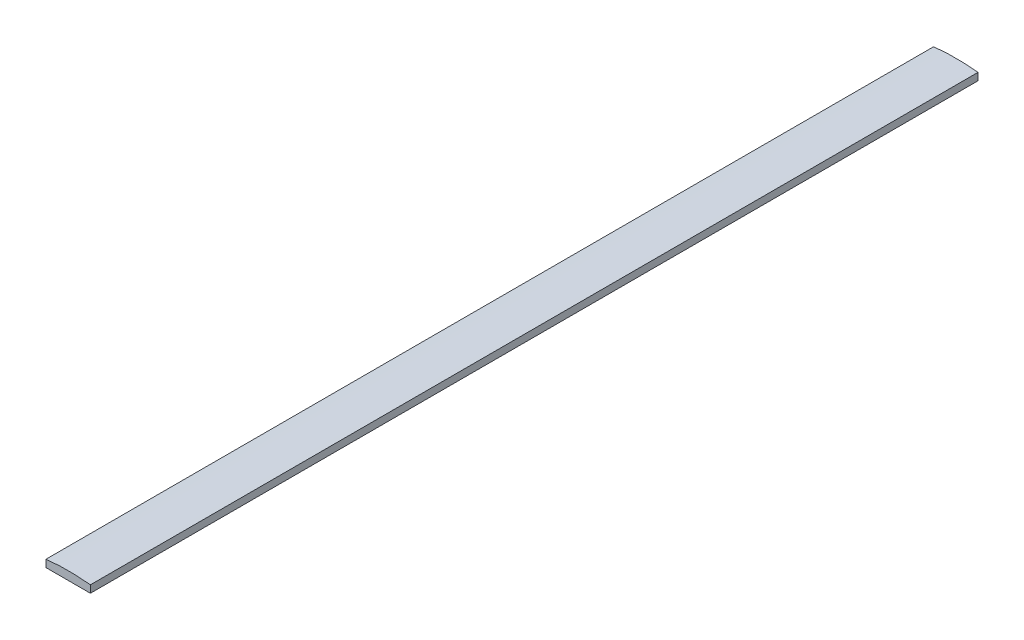
ISO-10303-21;
HEADER;
FILE_DESCRIPTION(('STEP AP214'),'2;1');
FILE_NAME('part.step','',(''),(''),'','','');
FILE_SCHEMA(('AUTOMOTIVE_DESIGN { 1 0 10303 214 1 1 1 1 }'));
ENDSEC;
DATA;
#1=APPLICATION_CONTEXT('core data for automotive mechanical design processes');
#2=APPLICATION_PROTOCOL_DEFINITION('international standard','automotive_design',2000,#1);
#3=PRODUCT_CONTEXT('',#1,'mechanical');
#4=PRODUCT('Part','Part','',(#3));
#5=PRODUCT_RELATED_PRODUCT_CATEGORY('part','',(#4));
#6=PRODUCT_DEFINITION_FORMATION('','',#4);
#7=PRODUCT_DEFINITION_CONTEXT('part definition',#1,'design');
#8=PRODUCT_DEFINITION('design','',#6,#7);
#9=PRODUCT_DEFINITION_SHAPE('','',#8);
#10=(LENGTH_UNIT() NAMED_UNIT(*) SI_UNIT(.MILLI.,.METRE.));
#11=(NAMED_UNIT(*) PLANE_ANGLE_UNIT() SI_UNIT($,.RADIAN.));
#12=(NAMED_UNIT(*) SI_UNIT($,.STERADIAN.) SOLID_ANGLE_UNIT());
#13=UNCERTAINTY_MEASURE_WITH_UNIT(LENGTH_MEASURE(1.E-05),#10,'distance_accuracy_value','');
#14=(GEOMETRIC_REPRESENTATION_CONTEXT(3) GLOBAL_UNCERTAINTY_ASSIGNED_CONTEXT((#13)) GLOBAL_UNIT_ASSIGNED_CONTEXT((#10,
#11,#12)) REPRESENTATION_CONTEXT('',''));
#15=CARTESIAN_POINT('',(0.,0.,0.));
#16=DIRECTION('',(0.,0.,1.));
#17=DIRECTION('',(1.,0.,0.));
#18=AXIS2_PLACEMENT_3D('',#15,#16,#17);
#19=CARTESIAN_POINT('',(-4.40361746141907,-70.4674372057608,330.));
#20=DIRECTION('',(0.,0.,-1.));
#21=DIRECTION('',(-1.,0.,0.));
#22=AXIS2_PLACEMENT_3D('',#19,#20,#21);
#23=CYLINDRICAL_SURFACE('',#22,76.);
#24=CARTESIAN_POINT('',(-4.40361746141907,-70.4674372057608,0.));
#25=DIRECTION('',(0.,0.,1.));
#26=DIRECTION('',(1.,0.,0.));
#27=AXIS2_PLACEMENT_3D('',#24,#25,#26);
#28=CIRCLE('',#27,76.);
#29=CARTESIAN_POINT('',(3.84638253858093,5.08345623700397,0.));
#30=VERTEX_POINT('',#29);
#31=CARTESIAN_POINT('',(-12.6536174614191,5.08345623700397,0.));
#32=VERTEX_POINT('',#31);
#33=EDGE_CURVE('E96',#30,#32,#28,.T.);
#34=ORIENTED_EDGE('',*,*,#33,.T.);
#35=DIRECTION('',(0.,0.,-1.));
#36=VECTOR('',#35,1.);
#37=CARTESIAN_POINT('',(-12.6536174614191,5.08345623700397,330.));
#38=LINE('',#37,#36);
#39=CARTESIAN_POINT('',(-12.6536174614191,5.08345623700397,330.));
#40=VERTEX_POINT('',#39);
#41=EDGE_CURVE('E11',#40,#32,#38,.T.);
#42=ORIENTED_EDGE('',*,*,#41,.F.);
#43=CARTESIAN_POINT('',(-4.40361746141907,-70.4674372057608,330.));
#44=DIRECTION('',(0.,0.,1.));
#45=DIRECTION('',(1.,0.,0.));
#46=AXIS2_PLACEMENT_3D('',#43,#44,#45);
#47=CIRCLE('',#46,76.);
#48=CARTESIAN_POINT('',(3.84638253858093,5.08345623700397,330.));
#49=VERTEX_POINT('',#48);
#50=EDGE_CURVE('E84',#49,#40,#47,.T.);
#51=ORIENTED_EDGE('',*,*,#50,.F.);
#52=DIRECTION('',(0.,0.,-1.));
#53=VECTOR('',#52,1.);
#54=CARTESIAN_POINT('',(3.84638253858093,5.08345623700397,330.));
#55=LINE('',#54,#53);
#56=EDGE_CURVE('E92',#49,#30,#55,.T.);
#57=ORIENTED_EDGE('',*,*,#56,.T.);
#58=EDGE_LOOP('',(#34,#42,#51,#57));
#59=FACE_BOUND('',#58,.T.);
#60=ADVANCED_FACE('F33',(#59),#23,.T.);
#61=CARTESIAN_POINT('',(-12.6536174614191,5.08345623700397,330.));
#62=DIRECTION('',(1.,0.,0.));
#63=DIRECTION('',(0.,0.,-1.));
#64=AXIS2_PLACEMENT_3D('',#61,#62,#63);
#65=PLANE('',#64);
#66=DIRECTION('',(0.,-1.,0.));
#67=VECTOR('',#66,1.);
#68=CARTESIAN_POINT('',(-12.6536174614191,5.08345623700397,0.));
#69=LINE('',#68,#67);
#70=CARTESIAN_POINT('',(-12.6536174614191,2.35745623700397,0.));
#71=VERTEX_POINT('',#70);
#72=EDGE_CURVE('E88',#32,#71,#69,.T.);
#73=ORIENTED_EDGE('',*,*,#72,.T.);
#74=DIRECTION('',(0.,0.,-1.));
#75=VECTOR('',#74,1.);
#76=CARTESIAN_POINT('',(-12.6536174614191,2.35745623700397,330.));
#77=LINE('',#76,#75);
#78=CARTESIAN_POINT('',(-12.6536174614191,2.35745623700397,330.));
#79=VERTEX_POINT('',#78);
#80=EDGE_CURVE('E41',#79,#71,#77,.T.);
#81=ORIENTED_EDGE('',*,*,#80,.F.);
#82=DIRECTION('',(0.,-1.,0.));
#83=VECTOR('',#82,1.);
#84=CARTESIAN_POINT('',(-12.6536174614191,5.08345623700397,330.));
#85=LINE('',#84,#83);
#86=EDGE_CURVE('E79',#40,#79,#85,.T.);
#87=ORIENTED_EDGE('',*,*,#86,.F.);
#88=ORIENTED_EDGE('',*,*,#41,.T.);
#89=EDGE_LOOP('',(#73,#81,#87,#88));
#90=FACE_BOUND('',#89,.T.);
#91=ADVANCED_FACE('F87',(#90),#65,.F.);
#92=CARTESIAN_POINT('',(-12.6536174614191,2.35745623700397,330.));
#93=DIRECTION('',(0.,1.,0.));
#94=DIRECTION('',(0.,0.,1.));
#95=AXIS2_PLACEMENT_3D('',#92,#93,#94);
#96=PLANE('',#95);
#97=DIRECTION('',(1.,0.,0.));
#98=VECTOR('',#97,1.);
#99=CARTESIAN_POINT('',(-12.6536174614191,2.35745623700397,0.));
#100=LINE('',#99,#98);
#101=CARTESIAN_POINT('',(3.84638253858093,2.35745623700397,0.));
#102=VERTEX_POINT('',#101);
#103=EDGE_CURVE('E66',#71,#102,#100,.T.);
#104=ORIENTED_EDGE('',*,*,#103,.T.);
#105=DIRECTION('',(0.,0.,-1.));
#106=VECTOR('',#105,1.);
#107=CARTESIAN_POINT('',(3.84638253858093,2.35745623700397,330.));
#108=LINE('',#107,#106);
#109=CARTESIAN_POINT('',(3.84638253858093,2.35745623700397,330.));
#110=VERTEX_POINT('',#109);
#111=EDGE_CURVE('E89',#110,#102,#108,.T.);
#112=ORIENTED_EDGE('',*,*,#111,.F.);
#113=DIRECTION('',(1.,0.,0.));
#114=VECTOR('',#113,1.);
#115=CARTESIAN_POINT('',(-12.6536174614191,2.35745623700397,330.));
#116=LINE('',#115,#114);
#117=EDGE_CURVE('E82',#79,#110,#116,.T.);
#118=ORIENTED_EDGE('',*,*,#117,.F.);
#119=ORIENTED_EDGE('',*,*,#80,.T.);
#120=EDGE_LOOP('',(#104,#112,#118,#119));
#121=FACE_BOUND('',#120,.T.);
#122=ADVANCED_FACE('F90',(#121),#96,.F.);
#123=CARTESIAN_POINT('',(3.84638253858093,5.08345623700397,330.));
#124=DIRECTION('',(-1.,0.,0.));
#125=DIRECTION('',(0.,0.,1.));
#126=AXIS2_PLACEMENT_3D('',#123,#124,#125);
#127=PLANE('',#126);
#128=DIRECTION('',(0.,1.,0.));
#129=VECTOR('',#128,1.);
#130=CARTESIAN_POINT('',(3.84638253858093,5.08345623700397,0.));
#131=LINE('',#130,#129);
#132=EDGE_CURVE('E72',#102,#30,#131,.T.);
#133=ORIENTED_EDGE('',*,*,#132,.T.);
#134=ORIENTED_EDGE('',*,*,#56,.F.);
#135=DIRECTION('',(0.,1.,0.));
#136=VECTOR('',#135,1.);
#137=CARTESIAN_POINT('',(3.84638253858093,5.08345623700397,330.));
#138=LINE('',#137,#136);
#139=EDGE_CURVE('E49',#110,#49,#138,.T.);
#140=ORIENTED_EDGE('',*,*,#139,.F.);
#141=ORIENTED_EDGE('',*,*,#111,.T.);
#142=EDGE_LOOP('',(#133,#134,#140,#141));
#143=FACE_BOUND('',#142,.T.);
#144=ADVANCED_FACE('F103',(#143),#127,.F.);
#145=CARTESIAN_POINT('',(-4.40361746141907,-70.4674372057608,330.));
#146=DIRECTION('',(0.,0.,1.));
#147=DIRECTION('',(1.,0.,0.));
#148=AXIS2_PLACEMENT_3D('',#145,#146,#147);
#149=PLANE('',#148);
#150=ORIENTED_EDGE('',*,*,#50,.T.);
#151=ORIENTED_EDGE('',*,*,#86,.T.);
#152=ORIENTED_EDGE('',*,*,#117,.T.);
#153=ORIENTED_EDGE('',*,*,#139,.T.);
#154=EDGE_LOOP('',(#150,#151,#152,#153));
#155=FACE_BOUND('',#154,.T.);
#156=ADVANCED_FACE('F80',(#155),#149,.T.);
#157=CARTESIAN_POINT('',(-4.40361746141907,-70.4674372057608,0.));
#158=DIRECTION('',(0.,0.,1.));
#159=DIRECTION('',(1.,0.,0.));
#160=AXIS2_PLACEMENT_3D('',#157,#158,#159);
#161=PLANE('',#160);
#162=ORIENTED_EDGE('',*,*,#33,.F.);
#163=ORIENTED_EDGE('',*,*,#132,.F.);
#164=ORIENTED_EDGE('',*,*,#103,.F.);
#165=ORIENTED_EDGE('',*,*,#72,.F.);
#166=EDGE_LOOP('',(#162,#163,#164,#165));
#167=FACE_BOUND('',#166,.T.);
#168=ADVANCED_FACE('F106',(#167),#161,.F.);
#169=CLOSED_SHELL('',(#60,#91,#122,#144,#156,#168));
#170=MANIFOLD_SOLID_BREP('B2',#169);
#171=ADVANCED_BREP_SHAPE_REPRESENTATION('',(#18,#170),#14);
#172=SHAPE_DEFINITION_REPRESENTATION(#9,#171);
ENDSEC;
END-ISO-10303-21;
